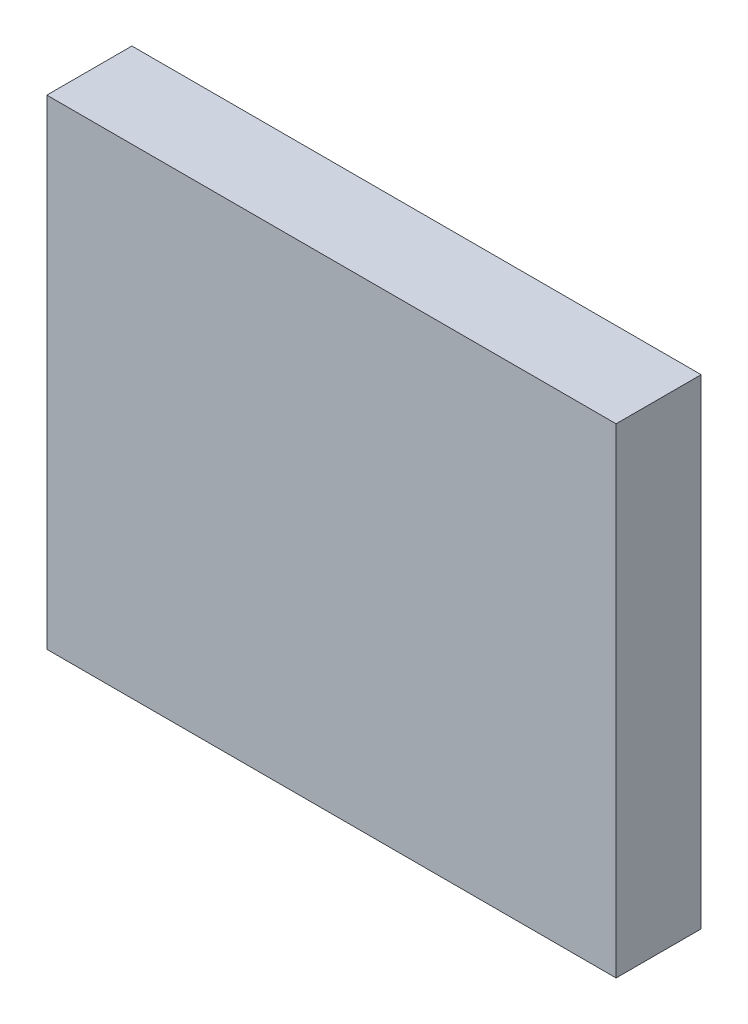
ISO-10303-21;
HEADER;
FILE_DESCRIPTION(('STEP AP214'),'2;1');
FILE_NAME('part.step','',(''),(''),'','','');
FILE_SCHEMA(('AUTOMOTIVE_DESIGN { 1 0 10303 214 1 1 1 1 }'));
ENDSEC;
DATA;
#1=APPLICATION_CONTEXT('core data for automotive mechanical design processes');
#2=APPLICATION_PROTOCOL_DEFINITION('international standard','automotive_design',2000,#1);
#3=PRODUCT_CONTEXT('',#1,'mechanical');
#4=PRODUCT('Part','Part','',(#3));
#5=PRODUCT_RELATED_PRODUCT_CATEGORY('part','',(#4));
#6=PRODUCT_DEFINITION_FORMATION('','',#4);
#7=PRODUCT_DEFINITION_CONTEXT('part definition',#1,'design');
#8=PRODUCT_DEFINITION('design','',#6,#7);
#9=PRODUCT_DEFINITION_SHAPE('','',#8);
#10=(LENGTH_UNIT() NAMED_UNIT(*) SI_UNIT(.MILLI.,.METRE.));
#11=(NAMED_UNIT(*) PLANE_ANGLE_UNIT() SI_UNIT($,.RADIAN.));
#12=(NAMED_UNIT(*) SI_UNIT($,.STERADIAN.) SOLID_ANGLE_UNIT());
#13=UNCERTAINTY_MEASURE_WITH_UNIT(LENGTH_MEASURE(1.E-05),#10,'distance_accuracy_value','');
#14=(GEOMETRIC_REPRESENTATION_CONTEXT(3) GLOBAL_UNCERTAINTY_ASSIGNED_CONTEXT((#13)) GLOBAL_UNIT_ASSIGNED_CONTEXT((#10,
#11,#12)) REPRESENTATION_CONTEXT('',''));
#15=CARTESIAN_POINT('',(0.,0.,0.));
#16=DIRECTION('',(0.,0.,1.));
#17=DIRECTION('',(1.,0.,0.));
#18=AXIS2_PLACEMENT_3D('',#15,#16,#17);
#19=CARTESIAN_POINT('',(2.55,2.15,0.762001524003));
#20=DIRECTION('',(0.,0.,1.));
#21=DIRECTION('',(-1.,0.,0.));
#22=AXIS2_PLACEMENT_3D('',#19,#20,#21);
#23=PLANE('',#22);
#24=DIRECTION('',(0.,1.,0.));
#25=VECTOR('',#24,1.);
#26=CARTESIAN_POINT('',(-2.55,0.,0.762001524003));
#27=LINE('',#26,#25);
#28=CARTESIAN_POINT('',(-2.55,-2.15,0.762001524003));
#29=VERTEX_POINT('',#28);
#30=CARTESIAN_POINT('',(-2.55,2.15,0.762001524003));
#31=VERTEX_POINT('',#30);
#32=EDGE_CURVE('E77',#29,#31,#27,.T.);
#33=ORIENTED_EDGE('',*,*,#32,.F.);
#34=DIRECTION('',(-1.,0.,0.));
#35=VECTOR('',#34,1.);
#36=CARTESIAN_POINT('',(0.,-2.15,0.762001524003));
#37=LINE('',#36,#35);
#38=CARTESIAN_POINT('',(2.55,-2.15,0.762001524003));
#39=VERTEX_POINT('',#38);
#40=EDGE_CURVE('E59',#39,#29,#37,.T.);
#41=ORIENTED_EDGE('',*,*,#40,.F.);
#42=DIRECTION('',(0.,1.,0.));
#43=VECTOR('',#42,1.);
#44=CARTESIAN_POINT('',(2.55,0.,0.762001524003));
#45=LINE('',#44,#43);
#46=CARTESIAN_POINT('',(2.55,2.15,0.762001524003));
#47=VERTEX_POINT('',#46);
#48=EDGE_CURVE('E21',#39,#47,#45,.T.);
#49=ORIENTED_EDGE('',*,*,#48,.T.);
#50=DIRECTION('',(-1.,0.,0.));
#51=VECTOR('',#50,1.);
#52=CARTESIAN_POINT('',(0.,2.15,0.762001524003));
#53=LINE('',#52,#51);
#54=EDGE_CURVE('E56',#47,#31,#53,.T.);
#55=ORIENTED_EDGE('',*,*,#54,.T.);
#56=EDGE_LOOP('',(#33,#41,#49,#55));
#57=FACE_BOUND('',#56,.T.);
#58=ADVANCED_FACE('F17',(#57),#23,.T.);
#59=CARTESIAN_POINT('',(2.55,-2.15,0.));
#60=DIRECTION('',(-1.,0.,0.));
#61=DIRECTION('',(0.,0.,1.));
#62=AXIS2_PLACEMENT_3D('',#59,#60,#61);
#63=PLANE('',#62);
#64=DIRECTION('',(0.,0.,1.));
#65=VECTOR('',#64,1.);
#66=CARTESIAN_POINT('',(2.55,-2.15,0.3810007620015));
#67=LINE('',#66,#65);
#68=CARTESIAN_POINT('',(2.55,-2.15,0.));
#69=VERTEX_POINT('',#68);
#70=EDGE_CURVE('E79',#69,#39,#67,.T.);
#71=ORIENTED_EDGE('',*,*,#70,.F.);
#72=DIRECTION('',(0.,1.,0.));
#73=VECTOR('',#72,1.);
#74=CARTESIAN_POINT('',(2.55,0.,0.));
#75=LINE('',#74,#73);
#76=CARTESIAN_POINT('',(2.55,2.15,0.));
#77=VERTEX_POINT('',#76);
#78=EDGE_CURVE('E74',#69,#77,#75,.T.);
#79=ORIENTED_EDGE('',*,*,#78,.T.);
#80=DIRECTION('',(0.,0.,1.));
#81=VECTOR('',#80,1.);
#82=CARTESIAN_POINT('',(2.55,2.15,0.3810007620015));
#83=LINE('',#82,#81);
#84=EDGE_CURVE('E64',#77,#47,#83,.T.);
#85=ORIENTED_EDGE('',*,*,#84,.T.);
#86=ORIENTED_EDGE('',*,*,#48,.F.);
#87=EDGE_LOOP('',(#71,#79,#85,#86));
#88=FACE_BOUND('',#87,.T.);
#89=ADVANCED_FACE('F73',(#88),#63,.F.);
#90=CARTESIAN_POINT('',(2.55,2.15,0.));
#91=DIRECTION('',(0.,-1.,0.));
#92=DIRECTION('',(0.,0.,1.));
#93=AXIS2_PLACEMENT_3D('',#90,#91,#92);
#94=PLANE('',#93);
#95=ORIENTED_EDGE('',*,*,#54,.F.);
#96=ORIENTED_EDGE('',*,*,#84,.F.);
#97=DIRECTION('',(-1.,0.,0.));
#98=VECTOR('',#97,1.);
#99=CARTESIAN_POINT('',(0.,2.15,0.));
#100=LINE('',#99,#98);
#101=CARTESIAN_POINT('',(-2.55,2.15,0.));
#102=VERTEX_POINT('',#101);
#103=EDGE_CURVE('E84',#77,#102,#100,.T.);
#104=ORIENTED_EDGE('',*,*,#103,.T.);
#105=DIRECTION('',(0.,0.,-1.));
#106=VECTOR('',#105,1.);
#107=CARTESIAN_POINT('',(-2.55,2.15,0.3810007620015));
#108=LINE('',#107,#106);
#109=EDGE_CURVE('E70',#31,#102,#108,.T.);
#110=ORIENTED_EDGE('',*,*,#109,.F.);
#111=EDGE_LOOP('',(#95,#96,#104,#110));
#112=FACE_BOUND('',#111,.T.);
#113=ADVANCED_FACE('F67',(#112),#94,.F.);
#114=CARTESIAN_POINT('',(-2.55,-2.15,0.));
#115=DIRECTION('',(-1.,0.,0.));
#116=DIRECTION('',(0.,0.,1.));
#117=AXIS2_PLACEMENT_3D('',#114,#115,#116);
#118=PLANE('',#117);
#119=DIRECTION('',(0.,0.,-1.));
#120=VECTOR('',#119,1.);
#121=CARTESIAN_POINT('',(-2.55,-2.15,0.3810007620015));
#122=LINE('',#121,#120);
#123=CARTESIAN_POINT('',(-2.55,-2.15,0.));
#124=VERTEX_POINT('',#123);
#125=EDGE_CURVE('E35',#29,#124,#122,.T.);
#126=ORIENTED_EDGE('',*,*,#125,.F.);
#127=ORIENTED_EDGE('',*,*,#32,.T.);
#128=ORIENTED_EDGE('',*,*,#109,.T.);
#129=DIRECTION('',(0.,-1.,0.));
#130=VECTOR('',#129,1.);
#131=CARTESIAN_POINT('',(-2.55,0.,0.));
#132=LINE('',#131,#130);
#133=EDGE_CURVE('E27',#102,#124,#132,.T.);
#134=ORIENTED_EDGE('',*,*,#133,.T.);
#135=EDGE_LOOP('',(#126,#127,#128,#134));
#136=FACE_BOUND('',#135,.T.);
#137=ADVANCED_FACE('F89',(#136),#118,.T.);
#138=CARTESIAN_POINT('',(2.55,-2.15,0.));
#139=DIRECTION('',(0.,-1.,0.));
#140=DIRECTION('',(0.,0.,1.));
#141=AXIS2_PLACEMENT_3D('',#138,#139,#140);
#142=PLANE('',#141);
#143=ORIENTED_EDGE('',*,*,#40,.T.);
#144=ORIENTED_EDGE('',*,*,#125,.T.);
#145=DIRECTION('',(1.,0.,0.));
#146=VECTOR('',#145,1.);
#147=CARTESIAN_POINT('',(0.,-2.15,0.));
#148=LINE('',#147,#146);
#149=EDGE_CURVE('E11',#124,#69,#148,.T.);
#150=ORIENTED_EDGE('',*,*,#149,.T.);
#151=ORIENTED_EDGE('',*,*,#70,.T.);
#152=EDGE_LOOP('',(#143,#144,#150,#151));
#153=FACE_BOUND('',#152,.T.);
#154=ADVANCED_FACE('F91',(#153),#142,.T.);
#155=CARTESIAN_POINT('',(2.55,2.15,0.));
#156=DIRECTION('',(0.,0.,1.));
#157=DIRECTION('',(-1.,0.,0.));
#158=AXIS2_PLACEMENT_3D('',#155,#156,#157);
#159=PLANE('',#158);
#160=ORIENTED_EDGE('',*,*,#133,.F.);
#161=ORIENTED_EDGE('',*,*,#103,.F.);
#162=ORIENTED_EDGE('',*,*,#78,.F.);
#163=ORIENTED_EDGE('',*,*,#149,.F.);
#164=EDGE_LOOP('',(#160,#161,#162,#163));
#165=FACE_BOUND('',#164,.T.);
#166=ADVANCED_FACE('F19',(#165),#159,.F.);
#167=CLOSED_SHELL('',(#58,#89,#113,#137,#154,#166));
#168=MANIFOLD_SOLID_BREP('B1',#167);
#169=ADVANCED_BREP_SHAPE_REPRESENTATION('',(#18,#168),#14);
#170=SHAPE_DEFINITION_REPRESENTATION(#9,#169);
ENDSEC;
END-ISO-10303-21;
